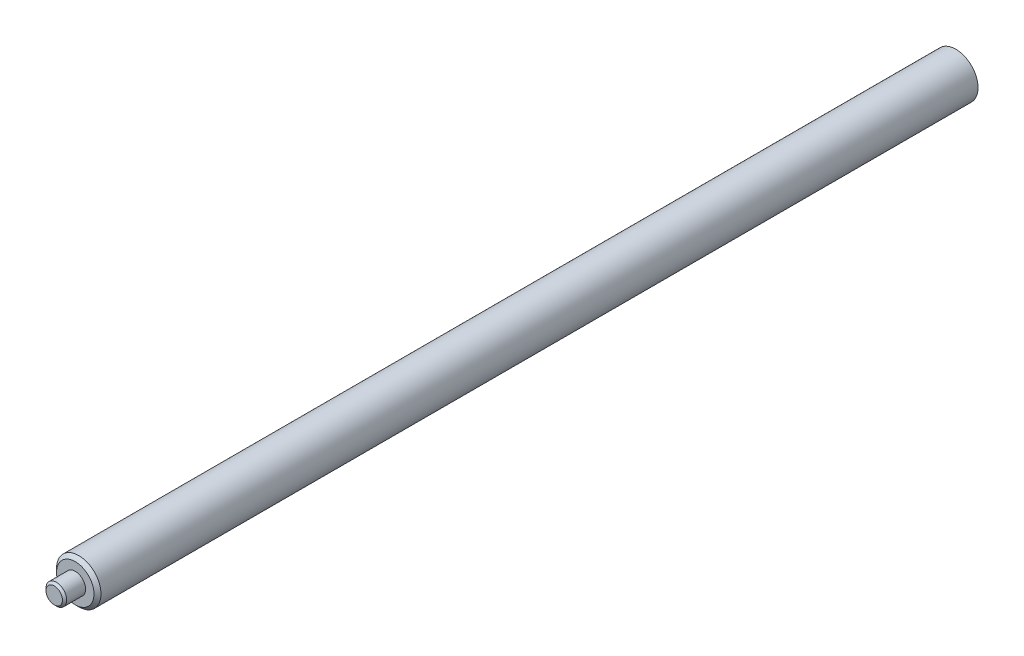
ISO-10303-21;
HEADER;
FILE_DESCRIPTION(('STEP AP214'),'2;1');
FILE_NAME('part.step','',(''),(''),'','','');
FILE_SCHEMA(('AUTOMOTIVE_DESIGN { 1 0 10303 214 1 1 1 1 }'));
ENDSEC;
DATA;
#1=APPLICATION_CONTEXT('core data for automotive mechanical design processes');
#2=APPLICATION_PROTOCOL_DEFINITION('international standard','automotive_design',2000,#1);
#3=PRODUCT_CONTEXT('',#1,'mechanical');
#4=PRODUCT('Part','Part','',(#3));
#5=PRODUCT_RELATED_PRODUCT_CATEGORY('part','',(#4));
#6=PRODUCT_DEFINITION_FORMATION('','',#4);
#7=PRODUCT_DEFINITION_CONTEXT('part definition',#1,'design');
#8=PRODUCT_DEFINITION('design','',#6,#7);
#9=PRODUCT_DEFINITION_SHAPE('','',#8);
#10=(LENGTH_UNIT() NAMED_UNIT(*) SI_UNIT(.MILLI.,.METRE.));
#11=(NAMED_UNIT(*) PLANE_ANGLE_UNIT() SI_UNIT($,.RADIAN.));
#12=(NAMED_UNIT(*) SI_UNIT($,.STERADIAN.) SOLID_ANGLE_UNIT());
#13=UNCERTAINTY_MEASURE_WITH_UNIT(LENGTH_MEASURE(1.E-05),#10,'distance_accuracy_value','');
#14=(GEOMETRIC_REPRESENTATION_CONTEXT(3) GLOBAL_UNCERTAINTY_ASSIGNED_CONTEXT((#13)) GLOBAL_UNIT_ASSIGNED_CONTEXT((#10,
#11,#12)) REPRESENTATION_CONTEXT('',''));
#15=CARTESIAN_POINT('',(0.,0.,0.));
#16=DIRECTION('',(0.,0.,1.));
#17=DIRECTION('',(1.,0.,0.));
#18=AXIS2_PLACEMENT_3D('',#15,#16,#17);
#19=CARTESIAN_POINT('',(0.,0.,128.7));
#20=DIRECTION('',(0.,0.,1.));
#21=DIRECTION('',(1.,0.,0.));
#22=AXIS2_PLACEMENT_3D('',#19,#20,#21);
#23=PLANE('',#22);
#24=CARTESIAN_POINT('',(0.,0.,128.700000000038));
#25=DIRECTION('',(0.,0.,-1.));
#26=DIRECTION('',(-1.,0.,0.));
#27=AXIS2_PLACEMENT_3D('',#24,#25,#26);
#28=CIRCLE('',#27,1.17499999993242);
#29=CARTESIAN_POINT('',(-1.17499999993242,0.,128.700000000038));
#30=VERTEX_POINT('',#29);
#31=EDGE_CURVE('E18',#30,#30,#28,.T.);
#32=ORIENTED_EDGE('',*,*,#31,.F.);
#33=EDGE_LOOP('',(#32));
#34=FACE_BOUND('',#33,.T.);
#35=ADVANCED_FACE('F15',(#34),#23,.T.);
#36=CARTESIAN_POINT('',(0.,0.,128.399999999942));
#37=DIRECTION('',(0.,0.,-1.));
#38=DIRECTION('',(-1.,0.,0.));
#39=AXIS2_PLACEMENT_3D('',#36,#37,#38);
#40=CONICAL_SURFACE('',#39,1.47500000002765,0.785398163397448);
#41=ORIENTED_EDGE('',*,*,#31,.T.);
#42=EDGE_LOOP('',(#41));
#43=FACE_BOUND('',#42,.T.);
#44=CARTESIAN_POINT('',(0.,0.,128.4));
#45=DIRECTION('',(0.,0.,1.));
#46=DIRECTION('',(1.,0.,0.));
#47=AXIS2_PLACEMENT_3D('',#44,#45,#46);
#48=CIRCLE('',#47,1.475);
#49=CARTESIAN_POINT('',(1.475,0.,128.4));
#50=VERTEX_POINT('',#49);
#51=EDGE_CURVE('E31',#50,#50,#48,.F.);
#52=ORIENTED_EDGE('',*,*,#51,.F.);
#53=EDGE_LOOP('',(#52));
#54=FACE_BOUND('',#53,.T.);
#55=ADVANCED_FACE('F43',(#43,#54),#40,.T.);
#56=CARTESIAN_POINT('',(0.,0.,125.7));
#57=DIRECTION('',(0.,0.,1.));
#58=DIRECTION('',(1.,0.,0.));
#59=AXIS2_PLACEMENT_3D('',#56,#57,#58);
#60=CYLINDRICAL_SURFACE('',#59,1.475);
#61=CARTESIAN_POINT('',(0.,0.,125.7));
#62=DIRECTION('',(0.,0.,1.));
#63=DIRECTION('',(1.,0.,0.));
#64=AXIS2_PLACEMENT_3D('',#61,#62,#63);
#65=CIRCLE('',#64,1.475);
#66=CARTESIAN_POINT('',(1.475,0.,125.7));
#67=VERTEX_POINT('',#66);
#68=EDGE_CURVE('E33',#67,#67,#65,.F.);
#69=ORIENTED_EDGE('',*,*,#68,.F.);
#70=EDGE_LOOP('',(#69));
#71=FACE_BOUND('',#70,.T.);
#72=ORIENTED_EDGE('',*,*,#51,.T.);
#73=EDGE_LOOP('',(#72));
#74=FACE_BOUND('',#73,.T.);
#75=ADVANCED_FACE('F51',(#71,#74),#60,.T.);
#76=CARTESIAN_POINT('',(0.,0.,125.7));
#77=DIRECTION('',(0.,0.,1.));
#78=DIRECTION('',(1.,0.,0.));
#79=AXIS2_PLACEMENT_3D('',#76,#77,#78);
#80=PLANE('',#79);
#81=ORIENTED_EDGE('',*,*,#68,.T.);
#82=EDGE_LOOP('',(#81));
#83=FACE_BOUND('',#82,.T.);
#84=CARTESIAN_POINT('',(0.,0.,125.700000000052));
#85=DIRECTION('',(0.,0.,-1.));
#86=DIRECTION('',(-1.,0.,0.));
#87=AXIS2_PLACEMENT_3D('',#84,#85,#86);
#88=CIRCLE('',#87,2.6749999999538);
#89=CARTESIAN_POINT('',(-2.6749999999538,0.,125.700000000052));
#90=VERTEX_POINT('',#89);
#91=EDGE_CURVE('E27',#90,#90,#88,.T.);
#92=ORIENTED_EDGE('',*,*,#91,.F.);
#93=EDGE_LOOP('',(#92));
#94=FACE_BOUND('',#93,.T.);
#95=ADVANCED_FACE('F66',(#83,#94),#80,.T.);
#96=CARTESIAN_POINT('',(0.,0.,125.200000000007));
#97=DIRECTION('',(0.,0.,-1.));
#98=DIRECTION('',(-1.,0.,0.));
#99=AXIS2_PLACEMENT_3D('',#96,#97,#98);
#100=CONICAL_SURFACE('',#99,3.17499999999882,0.785398163397448);
#101=CARTESIAN_POINT('',(0.,0.,125.2));
#102=DIRECTION('',(0.,0.,-1.));
#103=DIRECTION('',(-1.,0.,0.));
#104=AXIS2_PLACEMENT_3D('',#101,#102,#103);
#105=CIRCLE('',#104,3.175);
#106=CARTESIAN_POINT('',(-3.175,0.,125.2));
#107=VERTEX_POINT('',#106);
#108=EDGE_CURVE('E22',#107,#107,#105,.T.);
#109=ORIENTED_EDGE('',*,*,#108,.F.);
#110=EDGE_LOOP('',(#109));
#111=FACE_BOUND('',#110,.T.);
#112=ORIENTED_EDGE('',*,*,#91,.T.);
#113=EDGE_LOOP('',(#112));
#114=FACE_BOUND('',#113,.T.);
#115=ADVANCED_FACE('F59',(#111,#114),#100,.T.);
#116=CARTESIAN_POINT('',(0.,0.,0.));
#117=DIRECTION('',(0.,0.,1.));
#118=DIRECTION('',(1.,0.,0.));
#119=AXIS2_PLACEMENT_3D('',#116,#117,#118);
#120=PLANE('',#119);
#121=CARTESIAN_POINT('',(0.,0.,0.));
#122=DIRECTION('',(0.,0.,-1.));
#123=DIRECTION('',(-1.,0.,0.));
#124=AXIS2_PLACEMENT_3D('',#121,#122,#123);
#125=CIRCLE('',#124,3.175);
#126=CARTESIAN_POINT('',(-3.175,0.,0.));
#127=VERTEX_POINT('',#126);
#128=EDGE_CURVE('E10',#127,#127,#125,.F.);
#129=ORIENTED_EDGE('',*,*,#128,.F.);
#130=EDGE_LOOP('',(#129));
#131=FACE_BOUND('',#130,.T.);
#132=ADVANCED_FACE('F54',(#131),#120,.F.);
#133=CARTESIAN_POINT('',(0.,0.,128.7));
#134=DIRECTION('',(0.,0.,-1.));
#135=DIRECTION('',(-1.,0.,0.));
#136=AXIS2_PLACEMENT_3D('',#133,#134,#135);
#137=CYLINDRICAL_SURFACE('',#136,3.175);
#138=ORIENTED_EDGE('',*,*,#128,.T.);
#139=EDGE_LOOP('',(#138));
#140=FACE_BOUND('',#139,.T.);
#141=ORIENTED_EDGE('',*,*,#108,.T.);
#142=EDGE_LOOP('',(#141));
#143=FACE_BOUND('',#142,.T.);
#144=ADVANCED_FACE('F52',(#140,#143),#137,.T.);
#145=CLOSED_SHELL('',(#35,#55,#75,#95,#115,#132,#144));
#146=MANIFOLD_SOLID_BREP('B1',#145);
#147=ADVANCED_BREP_SHAPE_REPRESENTATION('',(#18,#146),#14);
#148=SHAPE_DEFINITION_REPRESENTATION(#9,#147);
ENDSEC;
END-ISO-10303-21;
